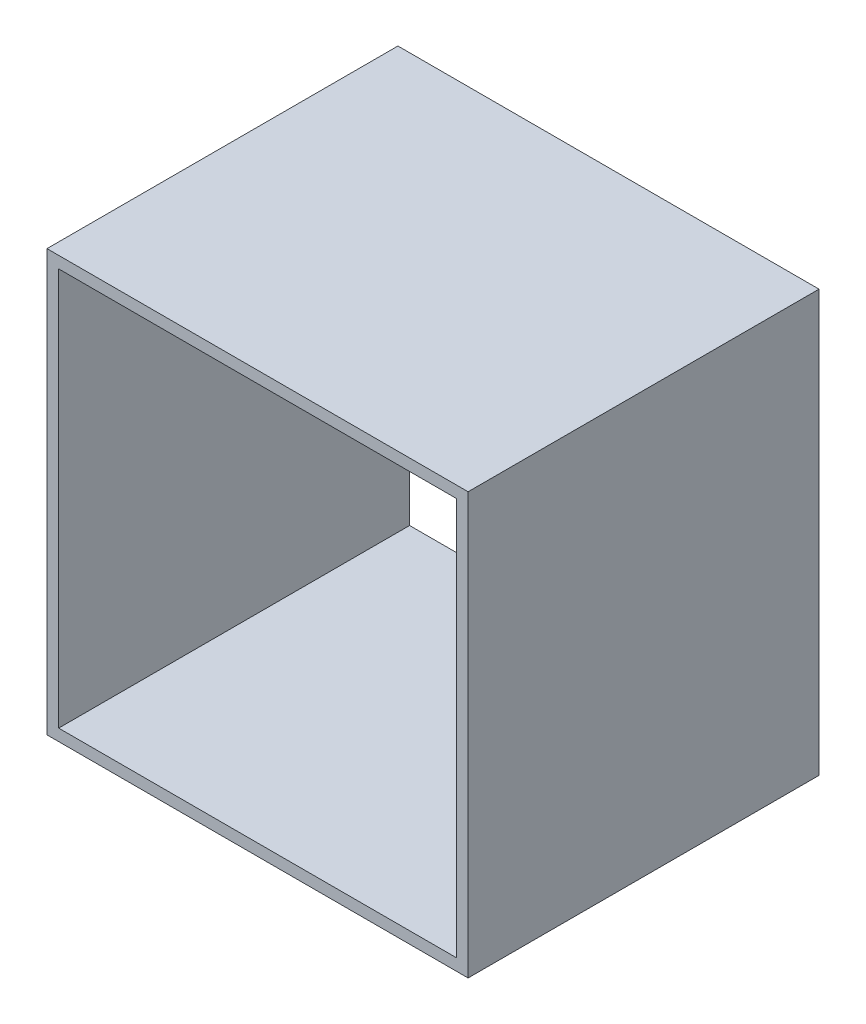
ISO-10303-21;
HEADER;
FILE_DESCRIPTION(('STEP AP214'),'2;1');
FILE_NAME('part.step','',(''),(''),'','','');
FILE_SCHEMA(('AUTOMOTIVE_DESIGN { 1 0 10303 214 1 1 1 1 }'));
ENDSEC;
DATA;
#1=APPLICATION_CONTEXT('core data for automotive mechanical design processes');
#2=APPLICATION_PROTOCOL_DEFINITION('international standard','automotive_design',2000,#1);
#3=PRODUCT_CONTEXT('',#1,'mechanical');
#4=PRODUCT('Part','Part','',(#3));
#5=PRODUCT_RELATED_PRODUCT_CATEGORY('part','',(#4));
#6=PRODUCT_DEFINITION_FORMATION('','',#4);
#7=PRODUCT_DEFINITION_CONTEXT('part definition',#1,'design');
#8=PRODUCT_DEFINITION('design','',#6,#7);
#9=PRODUCT_DEFINITION_SHAPE('','',#8);
#10=(LENGTH_UNIT() NAMED_UNIT(*) SI_UNIT(.MILLI.,.METRE.));
#11=(NAMED_UNIT(*) PLANE_ANGLE_UNIT() SI_UNIT($,.RADIAN.));
#12=(NAMED_UNIT(*) SI_UNIT($,.STERADIAN.) SOLID_ANGLE_UNIT());
#13=UNCERTAINTY_MEASURE_WITH_UNIT(LENGTH_MEASURE(1.E-05),#10,'distance_accuracy_value','');
#14=(GEOMETRIC_REPRESENTATION_CONTEXT(3) GLOBAL_UNCERTAINTY_ASSIGNED_CONTEXT((#13)) GLOBAL_UNIT_ASSIGNED_CONTEXT((#10,
#11,#12)) REPRESENTATION_CONTEXT('',''));
#15=CARTESIAN_POINT('',(0.,0.,0.));
#16=DIRECTION('',(0.,0.,1.));
#17=DIRECTION('',(1.,0.,0.));
#18=AXIS2_PLACEMENT_3D('',#15,#16,#17);
#19=CARTESIAN_POINT('',(-0.01,0.,-0.01));
#20=DIRECTION('',(0.,-1.,0.));
#21=DIRECTION('',(1.,0.,0.));
#22=AXIS2_PLACEMENT_3D('',#19,#20,#21);
#23=PLANE('',#22);
#24=DIRECTION('',(1.,0.,0.));
#25=VECTOR('',#24,1.);
#26=CARTESIAN_POINT('',(228.6,0.,381.));
#27=LINE('',#26,#25);
#28=CARTESIAN_POINT('',(0.,0.,381.));
#29=VERTEX_POINT('',#28);
#30=CARTESIAN_POINT('',(457.2,0.,381.));
#31=VERTEX_POINT('',#30);
#32=EDGE_CURVE('E86',#29,#31,#27,.T.);
#33=ORIENTED_EDGE('',*,*,#32,.F.);
#34=DIRECTION('',(0.,0.,1.));
#35=VECTOR('',#34,1.);
#36=CARTESIAN_POINT('',(0.,0.,190.5));
#37=LINE('',#36,#35);
#38=CARTESIAN_POINT('',(0.,0.,0.));
#39=VERTEX_POINT('',#38);
#40=EDGE_CURVE('E83',#39,#29,#37,.T.);
#41=ORIENTED_EDGE('',*,*,#40,.F.);
#42=DIRECTION('',(-1.,0.,0.));
#43=VECTOR('',#42,1.);
#44=CARTESIAN_POINT('',(228.6,0.,0.));
#45=LINE('',#44,#43);
#46=CARTESIAN_POINT('',(457.2,0.,0.));
#47=VERTEX_POINT('',#46);
#48=EDGE_CURVE('E80',#47,#39,#45,.T.);
#49=ORIENTED_EDGE('',*,*,#48,.F.);
#50=DIRECTION('',(0.,0.,-1.));
#51=VECTOR('',#50,1.);
#52=CARTESIAN_POINT('',(457.2,0.,190.5));
#53=LINE('',#52,#51);
#54=EDGE_CURVE('E21',#31,#47,#53,.T.);
#55=ORIENTED_EDGE('',*,*,#54,.F.);
#56=EDGE_LOOP('',(#33,#41,#49,#55));
#57=FACE_BOUND('',#56,.T.);
#58=ADVANCED_FACE('F17',(#57),#23,.T.);
#59=CARTESIAN_POINT('',(457.2,-0.01,-0.01));
#60=DIRECTION('',(1.,0.,0.));
#61=DIRECTION('',(0.,1.,0.));
#62=AXIS2_PLACEMENT_3D('',#59,#60,#61);
#63=PLANE('',#62);
#64=DIRECTION('',(0.,1.,0.));
#65=VECTOR('',#64,1.);
#66=CARTESIAN_POINT('',(457.2,228.6,381.));
#67=LINE('',#66,#65);
#68=CARTESIAN_POINT('',(457.2,457.2,381.));
#69=VERTEX_POINT('',#68);
#70=EDGE_CURVE('E114',#31,#69,#67,.T.);
#71=ORIENTED_EDGE('',*,*,#70,.F.);
#72=ORIENTED_EDGE('',*,*,#54,.T.);
#73=DIRECTION('',(0.,-1.,0.));
#74=VECTOR('',#73,1.);
#75=CARTESIAN_POINT('',(457.2,228.6,0.));
#76=LINE('',#75,#74);
#77=CARTESIAN_POINT('',(457.2,457.2,0.));
#78=VERTEX_POINT('',#77);
#79=EDGE_CURVE('E104',#78,#47,#76,.T.);
#80=ORIENTED_EDGE('',*,*,#79,.F.);
#81=DIRECTION('',(0.,0.,-1.));
#82=VECTOR('',#81,1.);
#83=CARTESIAN_POINT('',(457.2,457.2,190.5));
#84=LINE('',#83,#82);
#85=EDGE_CURVE('E91',#69,#78,#84,.T.);
#86=ORIENTED_EDGE('',*,*,#85,.F.);
#87=EDGE_LOOP('',(#71,#72,#80,#86));
#88=FACE_BOUND('',#87,.T.);
#89=ADVANCED_FACE('F112',(#88),#63,.T.);
#90=CARTESIAN_POINT('',(457.21,457.2,-0.01));
#91=DIRECTION('',(0.,1.,0.));
#92=DIRECTION('',(-1.,0.,0.));
#93=AXIS2_PLACEMENT_3D('',#90,#91,#92);
#94=PLANE('',#93);
#95=DIRECTION('',(-1.,0.,0.));
#96=VECTOR('',#95,1.);
#97=CARTESIAN_POINT('',(228.6,457.2,381.));
#98=LINE('',#97,#96);
#99=CARTESIAN_POINT('',(-1.50278642780498E-13,457.2,381.));
#100=VERTEX_POINT('',#99);
#101=EDGE_CURVE('E117',#69,#100,#98,.T.);
#102=ORIENTED_EDGE('',*,*,#101,.F.);
#103=ORIENTED_EDGE('',*,*,#85,.T.);
#104=DIRECTION('',(1.,0.,0.));
#105=VECTOR('',#104,1.);
#106=CARTESIAN_POINT('',(228.6,457.2,0.));
#107=LINE('',#106,#105);
#108=CARTESIAN_POINT('',(-1.11280997233445E-13,457.2,0.));
#109=VERTEX_POINT('',#108);
#110=EDGE_CURVE('E99',#109,#78,#107,.T.);
#111=ORIENTED_EDGE('',*,*,#110,.F.);
#112=DIRECTION('',(0.,0.,-1.));
#113=VECTOR('',#112,1.);
#114=CARTESIAN_POINT('',(-1.39977129142543E-13,457.2,190.5));
#115=LINE('',#114,#113);
#116=EDGE_CURVE('E90',#100,#109,#115,.T.);
#117=ORIENTED_EDGE('',*,*,#116,.F.);
#118=EDGE_LOOP('',(#102,#103,#111,#117));
#119=FACE_BOUND('',#118,.T.);
#120=ADVANCED_FACE('F131',(#119),#94,.T.);
#121=CARTESIAN_POINT('',(-1.3998019075954E-13,457.21,-0.01));
#122=DIRECTION('',(-1.,0.,0.));
#123=DIRECTION('',(0.,-1.,0.));
#124=AXIS2_PLACEMENT_3D('',#121,#122,#123);
#125=PLANE('',#124);
#126=DIRECTION('',(0.,-1.,0.));
#127=VECTOR('',#126,1.);
#128=CARTESIAN_POINT('',(-1.42116881956221E-13,228.6,381.));
#129=LINE('',#128,#127);
#130=EDGE_CURVE('E120',#100,#29,#129,.T.);
#131=ORIENTED_EDGE('',*,*,#130,.F.);
#132=ORIENTED_EDGE('',*,*,#116,.T.);
#133=DIRECTION('',(0.,1.,0.));
#134=VECTOR('',#133,1.);
#135=CARTESIAN_POINT('',(0.,228.6,0.));
#136=LINE('',#135,#134);
#137=EDGE_CURVE('E94',#39,#109,#136,.T.);
#138=ORIENTED_EDGE('',*,*,#137,.F.);
#139=ORIENTED_EDGE('',*,*,#40,.T.);
#140=EDGE_LOOP('',(#131,#132,#138,#139));
#141=FACE_BOUND('',#140,.T.);
#142=ADVANCED_FACE('F95',(#141),#125,.T.);
#143=CARTESIAN_POINT('',(444.5,444.51,-0.01));
#144=DIRECTION('',(-1.,0.,0.));
#145=DIRECTION('',(0.,-1.,0.));
#146=AXIS2_PLACEMENT_3D('',#143,#144,#145);
#147=PLANE('',#146);
#148=DIRECTION('',(0.,-1.,0.));
#149=VECTOR('',#148,1.);
#150=CARTESIAN_POINT('',(444.5,228.6,381.));
#151=LINE('',#150,#149);
#152=CARTESIAN_POINT('',(444.5,444.5,381.));
#153=VERTEX_POINT('',#152);
#154=CARTESIAN_POINT('',(444.5,12.7,381.));
#155=VERTEX_POINT('',#154);
#156=EDGE_CURVE('E137',#153,#155,#151,.T.);
#157=ORIENTED_EDGE('',*,*,#156,.F.);
#158=DIRECTION('',(0.,0.,1.));
#159=VECTOR('',#158,1.);
#160=CARTESIAN_POINT('',(444.5,444.5,190.5));
#161=LINE('',#160,#159);
#162=CARTESIAN_POINT('',(444.5,444.5,0.));
#163=VERTEX_POINT('',#162);
#164=EDGE_CURVE('E121',#163,#153,#161,.T.);
#165=ORIENTED_EDGE('',*,*,#164,.F.);
#166=DIRECTION('',(0.,1.,0.));
#167=VECTOR('',#166,1.);
#168=CARTESIAN_POINT('',(444.5,228.6,0.));
#169=LINE('',#168,#167);
#170=CARTESIAN_POINT('',(444.5,12.7,0.));
#171=VERTEX_POINT('',#170);
#172=EDGE_CURVE('E129',#171,#163,#169,.T.);
#173=ORIENTED_EDGE('',*,*,#172,.F.);
#174=DIRECTION('',(0.,0.,-1.));
#175=VECTOR('',#174,1.);
#176=CARTESIAN_POINT('',(444.5,12.7,190.5));
#177=LINE('',#176,#175);
#178=EDGE_CURVE('E143',#155,#171,#177,.T.);
#179=ORIENTED_EDGE('',*,*,#178,.F.);
#180=EDGE_LOOP('',(#157,#165,#173,#179));
#181=FACE_BOUND('',#180,.T.);
#182=ADVANCED_FACE('F161',(#181),#147,.T.);
#183=CARTESIAN_POINT('',(457.21,-0.0100000000000122,0.));
#184=DIRECTION('',(0.,0.,-1.));
#185=DIRECTION('',(-1.,0.,0.));
#186=AXIS2_PLACEMENT_3D('',#183,#184,#185);
#187=PLANE('',#186);
#188=ORIENTED_EDGE('',*,*,#172,.T.);
#189=DIRECTION('',(1.,0.,0.));
#190=VECTOR('',#189,1.);
#191=CARTESIAN_POINT('',(228.6,444.5,0.));
#192=LINE('',#191,#190);
#193=CARTESIAN_POINT('',(12.6999999999999,444.5,0.));
#194=VERTEX_POINT('',#193);
#195=EDGE_CURVE('E123',#194,#163,#192,.T.);
#196=ORIENTED_EDGE('',*,*,#195,.F.);
#197=DIRECTION('',(0.,1.,0.));
#198=VECTOR('',#197,1.);
#199=CARTESIAN_POINT('',(12.6999999999999,228.6,0.));
#200=LINE('',#199,#198);
#201=CARTESIAN_POINT('',(12.6999999999999,12.7,0.));
#202=VERTEX_POINT('',#201);
#203=EDGE_CURVE('E146',#202,#194,#200,.T.);
#204=ORIENTED_EDGE('',*,*,#203,.F.);
#205=DIRECTION('',(-1.,0.,0.));
#206=VECTOR('',#205,1.);
#207=CARTESIAN_POINT('',(228.6,12.7,0.));
#208=LINE('',#207,#206);
#209=EDGE_CURVE('E139',#171,#202,#208,.T.);
#210=ORIENTED_EDGE('',*,*,#209,.F.);
#211=EDGE_LOOP('',(#188,#196,#204,#210));
#212=FACE_BOUND('',#211,.T.);
#213=ORIENTED_EDGE('',*,*,#110,.T.);
#214=ORIENTED_EDGE('',*,*,#79,.T.);
#215=ORIENTED_EDGE('',*,*,#48,.T.);
#216=ORIENTED_EDGE('',*,*,#137,.T.);
#217=EDGE_LOOP('',(#213,#214,#215,#216));
#218=FACE_BOUND('',#217,.T.);
#219=ADVANCED_FACE('F102',(#212,#218),#187,.T.);
#220=CARTESIAN_POINT('',(12.6899999999999,444.5,-0.01));
#221=DIRECTION('',(0.,-1.,0.));
#222=DIRECTION('',(1.,0.,0.));
#223=AXIS2_PLACEMENT_3D('',#220,#221,#222);
#224=PLANE('',#223);
#225=DIRECTION('',(1.,0.,0.));
#226=VECTOR('',#225,1.);
#227=CARTESIAN_POINT('',(228.6,444.5,381.));
#228=LINE('',#227,#226);
#229=CARTESIAN_POINT('',(12.6999999999999,444.5,381.));
#230=VERTEX_POINT('',#229);
#231=EDGE_CURVE('E132',#230,#153,#228,.T.);
#232=ORIENTED_EDGE('',*,*,#231,.F.);
#233=DIRECTION('',(0.,0.,1.));
#234=VECTOR('',#233,1.);
#235=CARTESIAN_POINT('',(12.6999999999999,444.5,190.5));
#236=LINE('',#235,#234);
#237=EDGE_CURVE('E149',#194,#230,#236,.T.);
#238=ORIENTED_EDGE('',*,*,#237,.F.);
#239=ORIENTED_EDGE('',*,*,#195,.T.);
#240=ORIENTED_EDGE('',*,*,#164,.T.);
#241=EDGE_LOOP('',(#232,#238,#239,#240));
#242=FACE_BOUND('',#241,.T.);
#243=ADVANCED_FACE('F158',(#242),#224,.T.);
#244=CARTESIAN_POINT('',(-0.0100000000001543,-0.0100000000000122,381.));
#245=DIRECTION('',(0.,0.,1.));
#246=DIRECTION('',(1.,0.,0.));
#247=AXIS2_PLACEMENT_3D('',#244,#245,#246);
#248=PLANE('',#247);
#249=ORIENTED_EDGE('',*,*,#156,.T.);
#250=DIRECTION('',(1.,0.,0.));
#251=VECTOR('',#250,1.);
#252=CARTESIAN_POINT('',(228.6,12.7,381.));
#253=LINE('',#252,#251);
#254=CARTESIAN_POINT('',(12.7,12.7,381.));
#255=VERTEX_POINT('',#254);
#256=EDGE_CURVE('E36',#255,#155,#253,.T.);
#257=ORIENTED_EDGE('',*,*,#256,.F.);
#258=DIRECTION('',(0.,-1.,0.));
#259=VECTOR('',#258,1.);
#260=CARTESIAN_POINT('',(12.6999999999999,228.6,381.));
#261=LINE('',#260,#259);
#262=EDGE_CURVE('E27',#230,#255,#261,.T.);
#263=ORIENTED_EDGE('',*,*,#262,.F.);
#264=ORIENTED_EDGE('',*,*,#231,.T.);
#265=EDGE_LOOP('',(#249,#257,#263,#264));
#266=FACE_BOUND('',#265,.T.);
#267=ORIENTED_EDGE('',*,*,#101,.T.);
#268=ORIENTED_EDGE('',*,*,#130,.T.);
#269=ORIENTED_EDGE('',*,*,#32,.T.);
#270=ORIENTED_EDGE('',*,*,#70,.T.);
#271=EDGE_LOOP('',(#267,#268,#269,#270));
#272=FACE_BOUND('',#271,.T.);
#273=ADVANCED_FACE('F119',(#266,#272),#248,.T.);
#274=CARTESIAN_POINT('',(444.51,12.7,-0.01));
#275=DIRECTION('',(0.,1.,0.));
#276=DIRECTION('',(-1.,0.,0.));
#277=AXIS2_PLACEMENT_3D('',#274,#275,#276);
#278=PLANE('',#277);
#279=ORIENTED_EDGE('',*,*,#256,.T.);
#280=ORIENTED_EDGE('',*,*,#178,.T.);
#281=ORIENTED_EDGE('',*,*,#209,.T.);
#282=DIRECTION('',(0.,0.,-1.));
#283=VECTOR('',#282,1.);
#284=CARTESIAN_POINT('',(12.7,12.7,190.5));
#285=LINE('',#284,#283);
#286=EDGE_CURVE('E11',#255,#202,#285,.T.);
#287=ORIENTED_EDGE('',*,*,#286,.F.);
#288=EDGE_LOOP('',(#279,#280,#281,#287));
#289=FACE_BOUND('',#288,.T.);
#290=ADVANCED_FACE('F164',(#289),#278,.T.);
#291=CARTESIAN_POINT('',(12.7,12.69,-0.01));
#292=DIRECTION('',(1.,0.,0.));
#293=DIRECTION('',(0.,1.,0.));
#294=AXIS2_PLACEMENT_3D('',#291,#292,#293);
#295=PLANE('',#294);
#296=ORIENTED_EDGE('',*,*,#262,.T.);
#297=ORIENTED_EDGE('',*,*,#286,.T.);
#298=ORIENTED_EDGE('',*,*,#203,.T.);
#299=ORIENTED_EDGE('',*,*,#237,.T.);
#300=EDGE_LOOP('',(#296,#297,#298,#299));
#301=FACE_BOUND('',#300,.T.);
#302=ADVANCED_FACE('F19',(#301),#295,.T.);
#303=CLOSED_SHELL('',(#58,#89,#120,#142,#182,#219,#243,#273,#290,#302));
#304=MANIFOLD_SOLID_BREP('B1',#303);
#305=ADVANCED_BREP_SHAPE_REPRESENTATION('',(#18,#304),#14);
#306=SHAPE_DEFINITION_REPRESENTATION(#9,#305);
ENDSEC;
END-ISO-10303-21;
